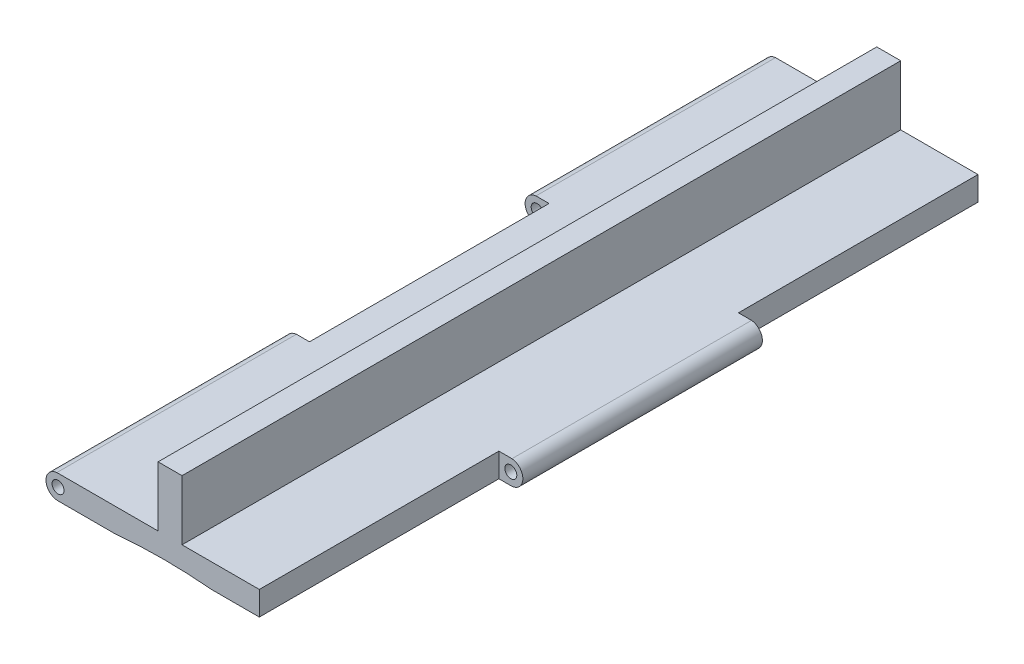
ISO-10303-21;
HEADER;
FILE_DESCRIPTION(('STEP AP214'),'2;1');
FILE_NAME('part.step','',(''),(''),'','','');
FILE_SCHEMA(('AUTOMOTIVE_DESIGN { 1 0 10303 214 1 1 1 1 }'));
ENDSEC;
DATA;
#1=APPLICATION_CONTEXT('core data for automotive mechanical design processes');
#2=APPLICATION_PROTOCOL_DEFINITION('international standard','automotive_design',2000,#1);
#3=PRODUCT_CONTEXT('',#1,'mechanical');
#4=PRODUCT('Part','Part','',(#3));
#5=PRODUCT_RELATED_PRODUCT_CATEGORY('part','',(#4));
#6=PRODUCT_DEFINITION_FORMATION('','',#4);
#7=PRODUCT_DEFINITION_CONTEXT('part definition',#1,'design');
#8=PRODUCT_DEFINITION('design','',#6,#7);
#9=PRODUCT_DEFINITION_SHAPE('','',#8);
#10=(LENGTH_UNIT() NAMED_UNIT(*) SI_UNIT(.MILLI.,.METRE.));
#11=(NAMED_UNIT(*) PLANE_ANGLE_UNIT() SI_UNIT($,.RADIAN.));
#12=(NAMED_UNIT(*) SI_UNIT($,.STERADIAN.) SOLID_ANGLE_UNIT());
#13=UNCERTAINTY_MEASURE_WITH_UNIT(LENGTH_MEASURE(1.E-05),#10,'distance_accuracy_value','');
#14=(GEOMETRIC_REPRESENTATION_CONTEXT(3) GLOBAL_UNCERTAINTY_ASSIGNED_CONTEXT((#13)) GLOBAL_UNIT_ASSIGNED_CONTEXT((#10,
#11,#12)) REPRESENTATION_CONTEXT('',''));
#15=CARTESIAN_POINT('',(0.,0.,0.));
#16=DIRECTION('',(0.,0.,1.));
#17=DIRECTION('',(1.,0.,0.));
#18=AXIS2_PLACEMENT_3D('',#15,#16,#17);
#19=CARTESIAN_POINT('',(-6.48648648648649,0.,60.));
#20=DIRECTION('',(0.,1.,0.));
#21=DIRECTION('',(0.,0.,1.));
#22=AXIS2_PLACEMENT_3D('',#19,#20,#21);
#23=PLANE('',#22);
#24=DIRECTION('',(1.,0.,0.));
#25=VECTOR('',#24,1.);
#26=CARTESIAN_POINT('',(-6.48648648648649,0.,0.));
#27=LINE('',#26,#25);
#28=CARTESIAN_POINT('',(-5.48648648648649,0.,0.));
#29=VERTEX_POINT('',#28);
#30=CARTESIAN_POINT('',(-0.581498924374398,0.,0.));
#31=VERTEX_POINT('',#30);
#32=EDGE_CURVE('E166',#29,#31,#27,.T.);
#33=ORIENTED_EDGE('',*,*,#32,.T.);
#34=DIRECTION('',(0.,0.,-1.));
#35=VECTOR('',#34,1.);
#36=CARTESIAN_POINT('',(-0.581498924374398,0.,60.));
#37=LINE('',#36,#35);
#38=CARTESIAN_POINT('',(-0.581498924374398,0.,60.));
#39=VERTEX_POINT('',#38);
#40=EDGE_CURVE('E169',#39,#31,#37,.T.);
#41=ORIENTED_EDGE('',*,*,#40,.F.);
#42=DIRECTION('',(1.,0.,0.));
#43=VECTOR('',#42,1.);
#44=CARTESIAN_POINT('',(-6.48648648648649,0.,60.));
#45=LINE('',#44,#43);
#46=CARTESIAN_POINT('',(-5.48648648648649,0.,60.));
#47=VERTEX_POINT('',#46);
#48=EDGE_CURVE('E309',#47,#39,#45,.T.);
#49=ORIENTED_EDGE('',*,*,#48,.F.);
#50=DIRECTION('',(0.,0.,-1.));
#51=VECTOR('',#50,1.);
#52=CARTESIAN_POINT('',(-5.48648648648649,0.,70.));
#53=LINE('',#52,#51);
#54=CARTESIAN_POINT('',(-5.48648648648649,0.,40.));
#55=VERTEX_POINT('',#54);
#56=EDGE_CURVE('E303',#47,#55,#53,.T.);
#57=ORIENTED_EDGE('',*,*,#56,.T.);
#58=DIRECTION('',(1.,0.,0.));
#59=VECTOR('',#58,1.);
#60=CARTESIAN_POINT('',(-6.48648648648649,0.,40.));
#61=LINE('',#60,#59);
#62=CARTESIAN_POINT('',(-4.39147404859857,0.,40.));
#63=VERTEX_POINT('',#62);
#64=EDGE_CURVE('E64',#55,#63,#61,.T.);
#65=ORIENTED_EDGE('',*,*,#64,.T.);
#66=DIRECTION('',(0.,0.,-1.));
#67=VECTOR('',#66,1.);
#68=CARTESIAN_POINT('',(-4.39147404859857,0.,60.));
#69=LINE('',#68,#67);
#70=CARTESIAN_POINT('',(-4.39147404859858,0.,20.));
#71=VERTEX_POINT('',#70);
#72=EDGE_CURVE('E282',#63,#71,#69,.T.);
#73=ORIENTED_EDGE('',*,*,#72,.T.);
#74=DIRECTION('',(-1.,0.,0.));
#75=VECTOR('',#74,1.);
#76=CARTESIAN_POINT('',(-6.48648648648649,0.,20.));
#77=LINE('',#76,#75);
#78=CARTESIAN_POINT('',(-5.48648648648649,0.,20.));
#79=VERTEX_POINT('',#78);
#80=EDGE_CURVE('E274',#71,#79,#77,.T.);
#81=ORIENTED_EDGE('',*,*,#80,.T.);
#82=EDGE_CURVE('E173',#79,#29,#53,.T.);
#83=ORIENTED_EDGE('',*,*,#82,.T.);
#84=EDGE_LOOP('',(#33,#41,#49,#57,#65,#73,#81,#83));
#85=FACE_BOUND('',#84,.T.);
#86=ADVANCED_FACE('F39',(#85),#23,.F.);
#87=CARTESIAN_POINT('',(-6.48648648648649,2.,60.));
#88=DIRECTION('',(0.,-1.,0.));
#89=DIRECTION('',(0.,0.,-1.));
#90=AXIS2_PLACEMENT_3D('',#87,#88,#89);
#91=PLANE('',#90);
#92=DIRECTION('',(0.,0.,-1.));
#93=VECTOR('',#92,1.);
#94=CARTESIAN_POINT('',(4.96600729456956,2.,60.));
#95=LINE('',#94,#93);
#96=CARTESIAN_POINT('',(4.96600729456956,2.,60.));
#97=VERTEX_POINT('',#96);
#98=CARTESIAN_POINT('',(4.96600729456956,2.,0.));
#99=VERTEX_POINT('',#98);
#100=EDGE_CURVE('E209',#97,#99,#95,.T.);
#101=ORIENTED_EDGE('',*,*,#100,.F.);
#102=DIRECTION('',(-1.,0.,0.));
#103=VECTOR('',#102,1.);
#104=CARTESIAN_POINT('',(-6.48648648648649,2.,60.));
#105=LINE('',#104,#103);
#106=CARTESIAN_POINT('',(11.4185010756256,2.,60.));
#107=VERTEX_POINT('',#106);
#108=EDGE_CURVE('E11',#107,#97,#105,.T.);
#109=ORIENTED_EDGE('',*,*,#108,.F.);
#110=DIRECTION('',(0.,0.,1.));
#111=VECTOR('',#110,1.);
#112=CARTESIAN_POINT('',(11.4185010756256,2.,60.));
#113=LINE('',#112,#111);
#114=CARTESIAN_POINT('',(11.4185010756256,2.,40.));
#115=VERTEX_POINT('',#114);
#116=EDGE_CURVE('E243',#115,#107,#113,.T.);
#117=ORIENTED_EDGE('',*,*,#116,.F.);
#118=DIRECTION('',(-1.,0.,0.));
#119=VECTOR('',#118,1.);
#120=CARTESIAN_POINT('',(11.4185010756256,2.,40.));
#121=LINE('',#120,#119);
#122=CARTESIAN_POINT('',(12.5135135135135,2.,40.));
#123=VERTEX_POINT('',#122);
#124=EDGE_CURVE('E251',#123,#115,#121,.T.);
#125=ORIENTED_EDGE('',*,*,#124,.F.);
#126=DIRECTION('',(0.,0.,-1.));
#127=VECTOR('',#126,1.);
#128=CARTESIAN_POINT('',(12.5135135135135,2.,70.));
#129=LINE('',#128,#127);
#130=CARTESIAN_POINT('',(12.5135135135135,2.,20.));
#131=VERTEX_POINT('',#130);
#132=EDGE_CURVE('E292',#123,#131,#129,.T.);
#133=ORIENTED_EDGE('',*,*,#132,.T.);
#134=DIRECTION('',(1.,0.,0.));
#135=VECTOR('',#134,1.);
#136=CARTESIAN_POINT('',(11.4185010756256,2.,20.));
#137=LINE('',#136,#135);
#138=CARTESIAN_POINT('',(11.4185010756256,2.,20.));
#139=VERTEX_POINT('',#138);
#140=EDGE_CURVE('E240',#139,#131,#137,.T.);
#141=ORIENTED_EDGE('',*,*,#140,.F.);
#142=DIRECTION('',(0.,0.,1.));
#143=VECTOR('',#142,1.);
#144=CARTESIAN_POINT('',(11.4185010756256,2.,0.));
#145=LINE('',#144,#143);
#146=CARTESIAN_POINT('',(11.4185010756256,2.,0.));
#147=VERTEX_POINT('',#146);
#148=EDGE_CURVE('E227',#147,#139,#145,.T.);
#149=ORIENTED_EDGE('',*,*,#148,.F.);
#150=DIRECTION('',(-1.,0.,0.));
#151=VECTOR('',#150,1.);
#152=CARTESIAN_POINT('',(-6.48648648648649,2.,0.));
#153=LINE('',#152,#151);
#154=EDGE_CURVE('E312',#147,#99,#153,.T.);
#155=ORIENTED_EDGE('',*,*,#154,.T.);
#156=EDGE_LOOP('',(#101,#109,#117,#125,#133,#141,#149,#155));
#157=FACE_BOUND('',#156,.T.);
#158=ADVANCED_FACE('F364',(#157),#91,.F.);
#159=CARTESIAN_POINT('',(-5.38648648648649,1.,70.));
#160=DIRECTION('',(0.,0.,-1.));
#161=DIRECTION('',(-1.,0.,0.));
#162=AXIS2_PLACEMENT_3D('',#159,#160,#161);
#163=CYLINDRICAL_SURFACE('',#162,1.00498756211209);
#164=CARTESIAN_POINT('',(-5.38648648648649,1.,20.));
#165=DIRECTION('',(0.,0.,-1.));
#166=DIRECTION('',(-1.,0.,0.));
#167=AXIS2_PLACEMENT_3D('',#164,#165,#166);
#168=CIRCLE('',#167,1.00498756211209);
#169=CARTESIAN_POINT('',(-5.48648648648649,2.,20.));
#170=VERTEX_POINT('',#169);
#171=EDGE_CURVE('E272',#79,#170,#168,.T.);
#172=ORIENTED_EDGE('',*,*,#171,.T.);
#173=DIRECTION('',(0.,0.,-1.));
#174=VECTOR('',#173,1.);
#175=CARTESIAN_POINT('',(-5.48648648648649,2.,70.));
#176=LINE('',#175,#174);
#177=CARTESIAN_POINT('',(-5.48648648648649,2.,0.));
#178=VERTEX_POINT('',#177);
#179=EDGE_CURVE('E291',#170,#178,#176,.T.);
#180=ORIENTED_EDGE('',*,*,#179,.T.);
#181=CARTESIAN_POINT('',(-5.38648648648649,1.,0.));
#182=DIRECTION('',(0.,0.,1.));
#183=DIRECTION('',(1.,0.,0.));
#184=AXIS2_PLACEMENT_3D('',#181,#182,#183);
#185=CIRCLE('',#184,1.00498756211209);
#186=EDGE_CURVE('E296',#178,#29,#185,.T.);
#187=ORIENTED_EDGE('',*,*,#186,.T.);
#188=ORIENTED_EDGE('',*,*,#82,.F.);
#189=EDGE_LOOP('',(#172,#180,#187,#188));
#190=FACE_BOUND('',#189,.T.);
#191=ADVANCED_FACE('F350',(#190),#163,.T.);
#192=CARTESIAN_POINT('',(-5.38648648648649,1.,70.));
#193=DIRECTION('',(0.,0.,-1.));
#194=DIRECTION('',(-1.,0.,0.));
#195=AXIS2_PLACEMENT_3D('',#192,#193,#194);
#196=CYLINDRICAL_SURFACE('',#195,0.5);
#197=CARTESIAN_POINT('',(-5.38648648648649,1.,20.));
#198=DIRECTION('',(0.,0.,-1.));
#199=DIRECTION('',(-1.,0.,0.));
#200=AXIS2_PLACEMENT_3D('',#197,#198,#199);
#201=CIRCLE('',#200,0.5);
#202=CARTESIAN_POINT('',(-5.88648648648649,1.,20.));
#203=VERTEX_POINT('',#202);
#204=EDGE_CURVE('E43',#203,#203,#201,.F.);
#205=ORIENTED_EDGE('',*,*,#204,.T.);
#206=EDGE_LOOP('',(#205));
#207=FACE_BOUND('',#206,.T.);
#208=CARTESIAN_POINT('',(-5.38648648648649,1.,0.));
#209=DIRECTION('',(0.,0.,-1.));
#210=DIRECTION('',(-1.,0.,0.));
#211=AXIS2_PLACEMENT_3D('',#208,#209,#210);
#212=CIRCLE('',#211,0.5);
#213=CARTESIAN_POINT('',(-5.88648648648649,1.,0.));
#214=VERTEX_POINT('',#213);
#215=EDGE_CURVE('E285',#214,#214,#212,.T.);
#216=ORIENTED_EDGE('',*,*,#215,.T.);
#217=EDGE_LOOP('',(#216));
#218=FACE_BOUND('',#217,.T.);
#219=ADVANCED_FACE('F403',(#207,#218),#196,.F.);
#220=CARTESIAN_POINT('',(7.4185010756256,0.,60.));
#221=VERTEX_POINT('',#220);
#222=CARTESIAN_POINT('',(11.4185010756256,0.,60.));
#223=VERTEX_POINT('',#222);
#224=EDGE_CURVE('E310',#221,#223,#45,.T.);
#225=ORIENTED_EDGE('',*,*,#224,.F.);
#226=DIRECTION('',(0.,0.,1.));
#227=VECTOR('',#226,1.);
#228=CARTESIAN_POINT('',(7.4185010756256,0.,60.));
#229=LINE('',#228,#227);
#230=CARTESIAN_POINT('',(7.4185010756256,0.,0.));
#231=VERTEX_POINT('',#230);
#232=EDGE_CURVE('E189',#231,#221,#229,.T.);
#233=ORIENTED_EDGE('',*,*,#232,.F.);
#234=CARTESIAN_POINT('',(11.4185010756256,0.,0.));
#235=VERTEX_POINT('',#234);
#236=EDGE_CURVE('E179',#231,#235,#27,.T.);
#237=ORIENTED_EDGE('',*,*,#236,.T.);
#238=DIRECTION('',(0.,0.,1.));
#239=VECTOR('',#238,1.);
#240=CARTESIAN_POINT('',(11.4185010756256,0.,60.));
#241=LINE('',#240,#239);
#242=CARTESIAN_POINT('',(11.4185010756256,0.,20.));
#243=VERTEX_POINT('',#242);
#244=EDGE_CURVE('E276',#235,#243,#241,.T.);
#245=ORIENTED_EDGE('',*,*,#244,.T.);
#246=DIRECTION('',(1.,0.,0.));
#247=VECTOR('',#246,1.);
#248=CARTESIAN_POINT('',(-6.48648648648649,0.,20.));
#249=LINE('',#248,#247);
#250=CARTESIAN_POINT('',(12.5135135135135,0.,20.));
#251=VERTEX_POINT('',#250);
#252=EDGE_CURVE('E265',#243,#251,#249,.T.);
#253=ORIENTED_EDGE('',*,*,#252,.T.);
#254=DIRECTION('',(0.,0.,-1.));
#255=VECTOR('',#254,1.);
#256=CARTESIAN_POINT('',(12.5135135135135,0.,70.));
#257=LINE('',#256,#255);
#258=CARTESIAN_POINT('',(12.5135135135135,0.,40.));
#259=VERTEX_POINT('',#258);
#260=EDGE_CURVE('E306',#251,#259,#257,.F.);
#261=ORIENTED_EDGE('',*,*,#260,.T.);
#262=DIRECTION('',(-1.,0.,0.));
#263=VECTOR('',#262,1.);
#264=CARTESIAN_POINT('',(-6.48648648648649,0.,40.));
#265=LINE('',#264,#263);
#266=CARTESIAN_POINT('',(11.4185010756256,0.,40.));
#267=VERTEX_POINT('',#266);
#268=EDGE_CURVE('E259',#259,#267,#265,.T.);
#269=ORIENTED_EDGE('',*,*,#268,.T.);
#270=DIRECTION('',(0.,0.,1.));
#271=VECTOR('',#270,1.);
#272=CARTESIAN_POINT('',(11.4185010756256,0.,60.));
#273=LINE('',#272,#271);
#274=EDGE_CURVE('E279',#267,#223,#273,.T.);
#275=ORIENTED_EDGE('',*,*,#274,.T.);
#276=EDGE_LOOP('',(#225,#233,#237,#245,#253,#261,#269,#275));
#277=FACE_BOUND('',#276,.T.);
#278=ADVANCED_FACE('F41',(#277),#23,.F.);
#279=CARTESIAN_POINT('',(2.96600729456956,2.,60.));
#280=VERTEX_POINT('',#279);
#281=CARTESIAN_POINT('',(-5.48648648648649,2.,60.));
#282=VERTEX_POINT('',#281);
#283=EDGE_CURVE('E48',#280,#282,#105,.T.);
#284=ORIENTED_EDGE('',*,*,#283,.F.);
#285=DIRECTION('',(0.,0.,-1.));
#286=VECTOR('',#285,1.);
#287=CARTESIAN_POINT('',(2.96600729456956,2.,60.));
#288=LINE('',#287,#286);
#289=CARTESIAN_POINT('',(2.96600729456956,2.,0.));
#290=VERTEX_POINT('',#289);
#291=EDGE_CURVE('E220',#280,#290,#288,.T.);
#292=ORIENTED_EDGE('',*,*,#291,.T.);
#293=EDGE_CURVE('E178',#290,#178,#153,.T.);
#294=ORIENTED_EDGE('',*,*,#293,.T.);
#295=ORIENTED_EDGE('',*,*,#179,.F.);
#296=DIRECTION('',(-1.,0.,0.));
#297=VECTOR('',#296,1.);
#298=CARTESIAN_POINT('',(-6.39147404859858,2.,20.));
#299=LINE('',#298,#297);
#300=CARTESIAN_POINT('',(-4.39147404859858,2.,20.));
#301=VERTEX_POINT('',#300);
#302=EDGE_CURVE('E230',#301,#170,#299,.T.);
#303=ORIENTED_EDGE('',*,*,#302,.F.);
#304=DIRECTION('',(0.,0.,-1.));
#305=VECTOR('',#304,1.);
#306=CARTESIAN_POINT('',(-4.39147404859858,2.,20.));
#307=LINE('',#306,#305);
#308=CARTESIAN_POINT('',(-4.39147404859857,2.,40.));
#309=VERTEX_POINT('',#308);
#310=EDGE_CURVE('E226',#309,#301,#307,.T.);
#311=ORIENTED_EDGE('',*,*,#310,.F.);
#312=DIRECTION('',(1.,0.,0.));
#313=VECTOR('',#312,1.);
#314=CARTESIAN_POINT('',(-6.39147404859857,2.,40.));
#315=LINE('',#314,#313);
#316=CARTESIAN_POINT('',(-5.48648648648649,2.,40.));
#317=VERTEX_POINT('',#316);
#318=EDGE_CURVE('E223',#317,#309,#315,.T.);
#319=ORIENTED_EDGE('',*,*,#318,.F.);
#320=EDGE_CURVE('E297',#282,#317,#176,.T.);
#321=ORIENTED_EDGE('',*,*,#320,.F.);
#322=EDGE_LOOP('',(#284,#292,#294,#295,#303,#311,#319,#321));
#323=FACE_BOUND('',#322,.T.);
#324=ADVANCED_FACE('F335',(#323),#91,.F.);
#325=CARTESIAN_POINT('',(0.,0.,60.));
#326=DIRECTION('',(0.,0.,1.));
#327=DIRECTION('',(1.,0.,0.));
#328=AXIS2_PLACEMENT_3D('',#325,#326,#327);
#329=PLANE('',#328);
#330=ORIENTED_EDGE('',*,*,#48,.T.);
#331=CARTESIAN_POINT('',(3.4185010756256,-42.3113459960801,60.));
#332=DIRECTION('',(0.,0.,1.));
#333=DIRECTION('',(1.,0.,0.));
#334=AXIS2_PLACEMENT_3D('',#331,#332,#333);
#335=CIRCLE('',#334,42.5);
#336=EDGE_CURVE('E188',#221,#39,#335,.T.);
#337=ORIENTED_EDGE('',*,*,#336,.F.);
#338=ORIENTED_EDGE('',*,*,#224,.T.);
#339=DIRECTION('',(0.,1.,0.));
#340=VECTOR('',#339,1.);
#341=CARTESIAN_POINT('',(11.4185010756256,-68.,60.));
#342=LINE('',#341,#340);
#343=EDGE_CURVE('E248',#223,#107,#342,.T.);
#344=ORIENTED_EDGE('',*,*,#343,.T.);
#345=ORIENTED_EDGE('',*,*,#108,.T.);
#346=DIRECTION('',(0.,-1.,0.));
#347=VECTOR('',#346,1.);
#348=CARTESIAN_POINT('',(4.96600729456956,7.,60.));
#349=LINE('',#348,#347);
#350=CARTESIAN_POINT('',(4.96600729456956,7.,60.));
#351=VERTEX_POINT('',#350);
#352=EDGE_CURVE('E200',#351,#97,#349,.T.);
#353=ORIENTED_EDGE('',*,*,#352,.F.);
#354=DIRECTION('',(1.,0.,0.));
#355=VECTOR('',#354,1.);
#356=CARTESIAN_POINT('',(4.96600729456956,7.,60.));
#357=LINE('',#356,#355);
#358=CARTESIAN_POINT('',(2.96600729456956,7.,60.));
#359=VERTEX_POINT('',#358);
#360=EDGE_CURVE('E206',#359,#351,#357,.T.);
#361=ORIENTED_EDGE('',*,*,#360,.F.);
#362=DIRECTION('',(0.,1.,0.));
#363=VECTOR('',#362,1.);
#364=CARTESIAN_POINT('',(2.96600729456956,7.,60.));
#365=LINE('',#364,#363);
#366=EDGE_CURVE('E202',#280,#359,#365,.T.);
#367=ORIENTED_EDGE('',*,*,#366,.F.);
#368=ORIENTED_EDGE('',*,*,#283,.T.);
#369=CARTESIAN_POINT('',(-5.38648648648649,1.,60.));
#370=DIRECTION('',(0.,0.,1.));
#371=DIRECTION('',(1.,0.,0.));
#372=AXIS2_PLACEMENT_3D('',#369,#370,#371);
#373=CIRCLE('',#372,1.00498756211209);
#374=EDGE_CURVE('E295',#47,#282,#373,.F.);
#375=ORIENTED_EDGE('',*,*,#374,.F.);
#376=EDGE_LOOP('',(#330,#337,#338,#344,#345,#353,#361,#367,#368,#375));
#377=FACE_BOUND('',#376,.T.);
#378=CARTESIAN_POINT('',(-5.38648648648649,1.,60.));
#379=DIRECTION('',(0.,0.,1.));
#380=DIRECTION('',(1.,0.,0.));
#381=AXIS2_PLACEMENT_3D('',#378,#379,#380);
#382=CIRCLE('',#381,0.5);
#383=CARTESIAN_POINT('',(-4.88648648648649,1.,60.));
#384=VERTEX_POINT('',#383);
#385=EDGE_CURVE('E288',#384,#384,#382,.T.);
#386=ORIENTED_EDGE('',*,*,#385,.F.);
#387=EDGE_LOOP('',(#386));
#388=FACE_BOUND('',#387,.T.);
#389=ADVANCED_FACE('F340',(#377,#388),#329,.T.);
#390=CARTESIAN_POINT('',(0.,0.,0.));
#391=DIRECTION('',(0.,0.,1.));
#392=DIRECTION('',(1.,0.,0.));
#393=AXIS2_PLACEMENT_3D('',#390,#391,#392);
#394=PLANE('',#393);
#395=CARTESIAN_POINT('',(3.4185010756256,-42.3113459960801,0.));
#396=DIRECTION('',(0.,0.,1.));
#397=DIRECTION('',(1.,0.,0.));
#398=AXIS2_PLACEMENT_3D('',#395,#396,#397);
#399=CIRCLE('',#398,42.5);
#400=EDGE_CURVE('E186',#231,#31,#399,.T.);
#401=ORIENTED_EDGE('',*,*,#400,.T.);
#402=ORIENTED_EDGE('',*,*,#32,.F.);
#403=ORIENTED_EDGE('',*,*,#186,.F.);
#404=ORIENTED_EDGE('',*,*,#293,.F.);
#405=DIRECTION('',(0.,1.,0.));
#406=VECTOR('',#405,1.);
#407=CARTESIAN_POINT('',(2.96600729456956,7.,0.));
#408=LINE('',#407,#406);
#409=CARTESIAN_POINT('',(2.96600729456956,7.,0.));
#410=VERTEX_POINT('',#409);
#411=EDGE_CURVE('E56',#290,#410,#408,.T.);
#412=ORIENTED_EDGE('',*,*,#411,.T.);
#413=DIRECTION('',(1.,0.,0.));
#414=VECTOR('',#413,1.);
#415=CARTESIAN_POINT('',(4.96600729456956,7.,0.));
#416=LINE('',#415,#414);
#417=CARTESIAN_POINT('',(4.96600729456956,7.,0.));
#418=VERTEX_POINT('',#417);
#419=EDGE_CURVE('E203',#410,#418,#416,.T.);
#420=ORIENTED_EDGE('',*,*,#419,.T.);
#421=DIRECTION('',(0.,-1.,0.));
#422=VECTOR('',#421,1.);
#423=CARTESIAN_POINT('',(4.96600729456956,7.,0.));
#424=LINE('',#423,#422);
#425=EDGE_CURVE('E199',#418,#99,#424,.T.);
#426=ORIENTED_EDGE('',*,*,#425,.T.);
#427=ORIENTED_EDGE('',*,*,#154,.F.);
#428=DIRECTION('',(0.,1.,0.));
#429=VECTOR('',#428,1.);
#430=CARTESIAN_POINT('',(11.4185010756256,-68.,0.));
#431=LINE('',#430,#429);
#432=EDGE_CURVE('E241',#235,#147,#431,.T.);
#433=ORIENTED_EDGE('',*,*,#432,.F.);
#434=ORIENTED_EDGE('',*,*,#236,.F.);
#435=EDGE_LOOP('',(#401,#402,#403,#404,#412,#420,#426,#427,#433,#434));
#436=FACE_BOUND('',#435,.T.);
#437=ORIENTED_EDGE('',*,*,#215,.F.);
#438=EDGE_LOOP('',(#437));
#439=FACE_BOUND('',#438,.T.);
#440=ADVANCED_FACE('F192',(#436,#439),#394,.F.);
#441=ORIENTED_EDGE('',*,*,#320,.T.);
#442=CARTESIAN_POINT('',(-5.38648648648649,1.,40.));
#443=DIRECTION('',(0.,0.,1.));
#444=DIRECTION('',(1.,0.,0.));
#445=AXIS2_PLACEMENT_3D('',#442,#443,#444);
#446=CIRCLE('',#445,1.00498756211209);
#447=EDGE_CURVE('E269',#317,#55,#446,.T.);
#448=ORIENTED_EDGE('',*,*,#447,.T.);
#449=ORIENTED_EDGE('',*,*,#56,.F.);
#450=ORIENTED_EDGE('',*,*,#374,.T.);
#451=EDGE_LOOP('',(#441,#448,#449,#450));
#452=FACE_BOUND('',#451,.T.);
#453=ADVANCED_FACE('F337',(#452),#163,.T.);
#454=CARTESIAN_POINT('',(12.4135135135135,1.,70.));
#455=DIRECTION('',(0.,0.,-1.));
#456=DIRECTION('',(-1.,0.,0.));
#457=AXIS2_PLACEMENT_3D('',#454,#455,#456);
#458=CYLINDRICAL_SURFACE('',#457,1.00498756211209);
#459=CARTESIAN_POINT('',(12.4135135135135,1.,20.));
#460=DIRECTION('',(0.,0.,1.));
#461=DIRECTION('',(1.,0.,0.));
#462=AXIS2_PLACEMENT_3D('',#459,#460,#461);
#463=CIRCLE('',#462,1.00498756211209);
#464=EDGE_CURVE('E263',#251,#131,#463,.T.);
#465=ORIENTED_EDGE('',*,*,#464,.T.);
#466=ORIENTED_EDGE('',*,*,#132,.F.);
#467=CARTESIAN_POINT('',(12.4135135135135,1.,40.));
#468=DIRECTION('',(0.,0.,-1.));
#469=DIRECTION('',(-1.,0.,0.));
#470=AXIS2_PLACEMENT_3D('',#467,#468,#469);
#471=CIRCLE('',#470,1.00498756211209);
#472=EDGE_CURVE('E256',#123,#259,#471,.T.);
#473=ORIENTED_EDGE('',*,*,#472,.T.);
#474=ORIENTED_EDGE('',*,*,#260,.F.);
#475=EDGE_LOOP('',(#465,#466,#473,#474));
#476=FACE_BOUND('',#475,.T.);
#477=ADVANCED_FACE('F383',(#476),#458,.T.);
#478=CARTESIAN_POINT('',(-5.38648648648649,1.,40.));
#479=DIRECTION('',(0.,0.,1.));
#480=DIRECTION('',(1.,0.,0.));
#481=AXIS2_PLACEMENT_3D('',#478,#479,#480);
#482=CIRCLE('',#481,0.5);
#483=CARTESIAN_POINT('',(-4.88648648648649,1.,40.));
#484=VERTEX_POINT('',#483);
#485=EDGE_CURVE('E268',#484,#484,#482,.F.);
#486=ORIENTED_EDGE('',*,*,#485,.T.);
#487=EDGE_LOOP('',(#486));
#488=FACE_BOUND('',#487,.T.);
#489=ORIENTED_EDGE('',*,*,#385,.T.);
#490=EDGE_LOOP('',(#489));
#491=FACE_BOUND('',#490,.T.);
#492=ADVANCED_FACE('F321',(#488,#491),#196,.F.);
#493=CARTESIAN_POINT('',(11.4185010756256,-68.,60.));
#494=DIRECTION('',(-1.,0.,0.));
#495=DIRECTION('',(0.,0.,1.));
#496=AXIS2_PLACEMENT_3D('',#493,#494,#495);
#497=PLANE('',#496);
#498=DIRECTION('',(0.,1.,0.));
#499=VECTOR('',#498,1.);
#500=CARTESIAN_POINT('',(11.4185010756256,-68.,40.));
#501=LINE('',#500,#499);
#502=EDGE_CURVE('E217',#267,#115,#501,.T.);
#503=ORIENTED_EDGE('',*,*,#502,.T.);
#504=ORIENTED_EDGE('',*,*,#116,.T.);
#505=ORIENTED_EDGE('',*,*,#343,.F.);
#506=ORIENTED_EDGE('',*,*,#274,.F.);
#507=EDGE_LOOP('',(#503,#504,#505,#506));
#508=FACE_BOUND('',#507,.T.);
#509=ADVANCED_FACE('F375',(#508),#497,.F.);
#510=CARTESIAN_POINT('',(11.4185010756256,-68.,40.));
#511=DIRECTION('',(0.,0.,-1.));
#512=DIRECTION('',(-1.,0.,0.));
#513=AXIS2_PLACEMENT_3D('',#510,#511,#512);
#514=PLANE('',#513);
#515=CARTESIAN_POINT('',(12.4135135135135,1.,40.));
#516=DIRECTION('',(0.,0.,-1.));
#517=DIRECTION('',(-1.,0.,0.));
#518=AXIS2_PLACEMENT_3D('',#515,#516,#517);
#519=CIRCLE('',#518,0.500000000000001);
#520=CARTESIAN_POINT('',(11.9135135135135,1.,40.));
#521=VERTEX_POINT('',#520);
#522=EDGE_CURVE('E236',#521,#521,#519,.F.);
#523=ORIENTED_EDGE('',*,*,#522,.F.);
#524=EDGE_LOOP('',(#523));
#525=FACE_BOUND('',#524,.T.);
#526=ORIENTED_EDGE('',*,*,#472,.F.);
#527=ORIENTED_EDGE('',*,*,#124,.T.);
#528=ORIENTED_EDGE('',*,*,#502,.F.);
#529=ORIENTED_EDGE('',*,*,#268,.F.);
#530=EDGE_LOOP('',(#526,#527,#528,#529));
#531=FACE_BOUND('',#530,.T.);
#532=ADVANCED_FACE('F379',(#525,#531),#514,.F.);
#533=CARTESIAN_POINT('',(11.4185010756256,-68.,0.));
#534=DIRECTION('',(-1.,0.,0.));
#535=DIRECTION('',(0.,0.,1.));
#536=AXIS2_PLACEMENT_3D('',#533,#534,#535);
#537=PLANE('',#536);
#538=ORIENTED_EDGE('',*,*,#432,.T.);
#539=ORIENTED_EDGE('',*,*,#148,.T.);
#540=DIRECTION('',(0.,1.,0.));
#541=VECTOR('',#540,1.);
#542=CARTESIAN_POINT('',(11.4185010756256,-68.,20.));
#543=LINE('',#542,#541);
#544=EDGE_CURVE('E238',#243,#139,#543,.T.);
#545=ORIENTED_EDGE('',*,*,#544,.F.);
#546=ORIENTED_EDGE('',*,*,#244,.F.);
#547=EDGE_LOOP('',(#538,#539,#545,#546));
#548=FACE_BOUND('',#547,.T.);
#549=ADVANCED_FACE('F369',(#548),#537,.F.);
#550=CARTESIAN_POINT('',(11.4185010756256,-68.,20.));
#551=DIRECTION('',(0.,0.,1.));
#552=DIRECTION('',(1.,0.,0.));
#553=AXIS2_PLACEMENT_3D('',#550,#551,#552);
#554=PLANE('',#553);
#555=CARTESIAN_POINT('',(12.4135135135135,1.,20.));
#556=DIRECTION('',(0.,0.,1.));
#557=DIRECTION('',(1.,0.,0.));
#558=AXIS2_PLACEMENT_3D('',#555,#556,#557);
#559=CIRCLE('',#558,0.500000000000001);
#560=CARTESIAN_POINT('',(12.9135135135135,1.,20.));
#561=VERTEX_POINT('',#560);
#562=EDGE_CURVE('E262',#561,#561,#559,.F.);
#563=ORIENTED_EDGE('',*,*,#562,.F.);
#564=EDGE_LOOP('',(#563));
#565=FACE_BOUND('',#564,.T.);
#566=ORIENTED_EDGE('',*,*,#544,.T.);
#567=ORIENTED_EDGE('',*,*,#140,.T.);
#568=ORIENTED_EDGE('',*,*,#464,.F.);
#569=ORIENTED_EDGE('',*,*,#252,.F.);
#570=EDGE_LOOP('',(#566,#567,#568,#569));
#571=FACE_BOUND('',#570,.T.);
#572=ADVANCED_FACE('F385',(#565,#571),#554,.F.);
#573=CARTESIAN_POINT('',(-4.39147404859858,-68.,20.));
#574=DIRECTION('',(1.,0.,0.));
#575=DIRECTION('',(0.,0.,-1.));
#576=AXIS2_PLACEMENT_3D('',#573,#574,#575);
#577=PLANE('',#576);
#578=DIRECTION('',(0.,1.,0.));
#579=VECTOR('',#578,1.);
#580=CARTESIAN_POINT('',(-4.39147404859857,-68.,40.));
#581=LINE('',#580,#579);
#582=EDGE_CURVE('E233',#63,#309,#581,.T.);
#583=ORIENTED_EDGE('',*,*,#582,.T.);
#584=ORIENTED_EDGE('',*,*,#310,.T.);
#585=DIRECTION('',(0.,1.,0.));
#586=VECTOR('',#585,1.);
#587=CARTESIAN_POINT('',(-4.39147404859858,-68.,20.));
#588=LINE('',#587,#586);
#589=EDGE_CURVE('E234',#71,#301,#588,.T.);
#590=ORIENTED_EDGE('',*,*,#589,.F.);
#591=ORIENTED_EDGE('',*,*,#72,.F.);
#592=EDGE_LOOP('',(#583,#584,#590,#591));
#593=FACE_BOUND('',#592,.T.);
#594=ADVANCED_FACE('F345',(#593),#577,.F.);
#595=CARTESIAN_POINT('',(-6.39147404859858,-68.,20.));
#596=DIRECTION('',(0.,0.,-1.));
#597=DIRECTION('',(-1.,0.,0.));
#598=AXIS2_PLACEMENT_3D('',#595,#596,#597);
#599=PLANE('',#598);
#600=ORIENTED_EDGE('',*,*,#204,.F.);
#601=EDGE_LOOP('',(#600));
#602=FACE_BOUND('',#601,.T.);
#603=ORIENTED_EDGE('',*,*,#589,.T.);
#604=ORIENTED_EDGE('',*,*,#302,.T.);
#605=ORIENTED_EDGE('',*,*,#171,.F.);
#606=ORIENTED_EDGE('',*,*,#80,.F.);
#607=EDGE_LOOP('',(#603,#604,#605,#606));
#608=FACE_BOUND('',#607,.T.);
#609=ADVANCED_FACE('F327',(#602,#608),#599,.F.);
#610=CARTESIAN_POINT('',(-6.39147404859857,-68.,40.));
#611=DIRECTION('',(0.,0.,1.));
#612=DIRECTION('',(1.,0.,0.));
#613=AXIS2_PLACEMENT_3D('',#610,#611,#612);
#614=PLANE('',#613);
#615=ORIENTED_EDGE('',*,*,#485,.F.);
#616=EDGE_LOOP('',(#615));
#617=FACE_BOUND('',#616,.T.);
#618=ORIENTED_EDGE('',*,*,#447,.F.);
#619=ORIENTED_EDGE('',*,*,#318,.T.);
#620=ORIENTED_EDGE('',*,*,#582,.F.);
#621=ORIENTED_EDGE('',*,*,#64,.F.);
#622=EDGE_LOOP('',(#618,#619,#620,#621));
#623=FACE_BOUND('',#622,.T.);
#624=ADVANCED_FACE('F324',(#617,#623),#614,.F.);
#625=CARTESIAN_POINT('',(12.4135135135135,1.,70.));
#626=DIRECTION('',(0.,0.,-1.));
#627=DIRECTION('',(-1.,0.,0.));
#628=AXIS2_PLACEMENT_3D('',#625,#626,#627);
#629=CYLINDRICAL_SURFACE('',#628,0.500000000000001);
#630=ORIENTED_EDGE('',*,*,#562,.T.);
#631=EDGE_LOOP('',(#630));
#632=FACE_BOUND('',#631,.T.);
#633=ORIENTED_EDGE('',*,*,#522,.T.);
#634=EDGE_LOOP('',(#633));
#635=FACE_BOUND('',#634,.T.);
#636=ADVANCED_FACE('F326',(#632,#635),#629,.F.);
#637=CARTESIAN_POINT('',(4.96600729456956,7.,60.));
#638=DIRECTION('',(1.,0.,0.));
#639=DIRECTION('',(0.,0.,-1.));
#640=AXIS2_PLACEMENT_3D('',#637,#638,#639);
#641=PLANE('',#640);
#642=ORIENTED_EDGE('',*,*,#425,.F.);
#643=DIRECTION('',(0.,0.,-1.));
#644=VECTOR('',#643,1.);
#645=CARTESIAN_POINT('',(4.96600729456956,7.,60.));
#646=LINE('',#645,#644);
#647=EDGE_CURVE('E215',#351,#418,#646,.T.);
#648=ORIENTED_EDGE('',*,*,#647,.F.);
#649=ORIENTED_EDGE('',*,*,#352,.T.);
#650=ORIENTED_EDGE('',*,*,#100,.T.);
#651=EDGE_LOOP('',(#642,#648,#649,#650));
#652=FACE_BOUND('',#651,.T.);
#653=ADVANCED_FACE('F460',(#652),#641,.T.);
#654=CARTESIAN_POINT('',(4.96600729456956,7.,60.));
#655=DIRECTION('',(0.,1.,0.));
#656=DIRECTION('',(0.,0.,1.));
#657=AXIS2_PLACEMENT_3D('',#654,#655,#656);
#658=PLANE('',#657);
#659=ORIENTED_EDGE('',*,*,#419,.F.);
#660=DIRECTION('',(0.,0.,-1.));
#661=VECTOR('',#660,1.);
#662=CARTESIAN_POINT('',(2.96600729456956,7.,60.));
#663=LINE('',#662,#661);
#664=EDGE_CURVE('E218',#359,#410,#663,.T.);
#665=ORIENTED_EDGE('',*,*,#664,.F.);
#666=ORIENTED_EDGE('',*,*,#360,.T.);
#667=ORIENTED_EDGE('',*,*,#647,.T.);
#668=EDGE_LOOP('',(#659,#665,#666,#667));
#669=FACE_BOUND('',#668,.T.);
#670=ADVANCED_FACE('F357',(#669),#658,.T.);
#671=CARTESIAN_POINT('',(2.96600729456956,7.,60.));
#672=DIRECTION('',(-1.,0.,0.));
#673=DIRECTION('',(0.,0.,1.));
#674=AXIS2_PLACEMENT_3D('',#671,#672,#673);
#675=PLANE('',#674);
#676=ORIENTED_EDGE('',*,*,#411,.F.);
#677=ORIENTED_EDGE('',*,*,#291,.F.);
#678=ORIENTED_EDGE('',*,*,#366,.T.);
#679=ORIENTED_EDGE('',*,*,#664,.T.);
#680=EDGE_LOOP('',(#676,#677,#678,#679));
#681=FACE_BOUND('',#680,.T.);
#682=ADVANCED_FACE('F353',(#681),#675,.T.);
#683=CARTESIAN_POINT('',(3.4185010756256,-42.3113459960801,60.));
#684=DIRECTION('',(0.,0.,-1.));
#685=DIRECTION('',(-1.,0.,0.));
#686=AXIS2_PLACEMENT_3D('',#683,#684,#685);
#687=CYLINDRICAL_SURFACE('',#686,42.5);
#688=ORIENTED_EDGE('',*,*,#400,.F.);
#689=ORIENTED_EDGE('',*,*,#232,.T.);
#690=ORIENTED_EDGE('',*,*,#336,.T.);
#691=ORIENTED_EDGE('',*,*,#40,.T.);
#692=EDGE_LOOP('',(#688,#689,#690,#691));
#693=FACE_BOUND('',#692,.T.);
#694=ADVANCED_FACE('F184',(#693),#687,.F.);
#695=CLOSED_SHELL('',(#86,#158,#191,#219,#278,#324,#389,#440,#453,#477,#492,#509,#532,#549,#572,
#594,#609,#624,#636,#653,#670,#682,#694));
#696=MANIFOLD_SOLID_BREP('B2',#695);
#697=ADVANCED_BREP_SHAPE_REPRESENTATION('',(#18,#696),#14);
#698=SHAPE_DEFINITION_REPRESENTATION(#9,#697);
ENDSEC;
END-ISO-10303-21;
